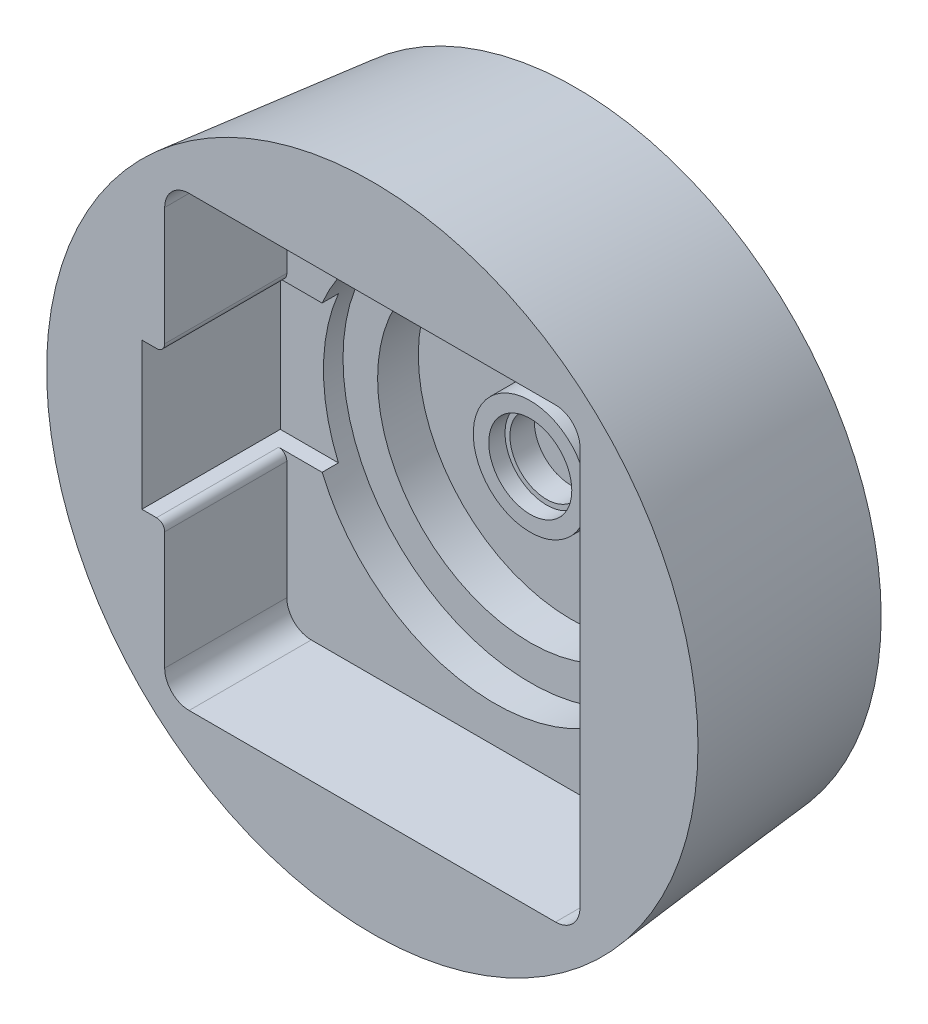
ISO-10303-21;
HEADER;
FILE_DESCRIPTION(('STEP AP214'),'2;1');
FILE_NAME('part.step','',(''),(''),'','','');
FILE_SCHEMA(('AUTOMOTIVE_DESIGN { 1 0 10303 214 1 1 1 1 }'));
ENDSEC;
DATA;
#1=APPLICATION_CONTEXT('core data for automotive mechanical design processes');
#2=APPLICATION_PROTOCOL_DEFINITION('international standard','automotive_design',2000,#1);
#3=PRODUCT_CONTEXT('',#1,'mechanical');
#4=PRODUCT('Part','Part','',(#3));
#5=PRODUCT_RELATED_PRODUCT_CATEGORY('part','',(#4));
#6=PRODUCT_DEFINITION_FORMATION('','',#4);
#7=PRODUCT_DEFINITION_CONTEXT('part definition',#1,'design');
#8=PRODUCT_DEFINITION('design','',#6,#7);
#9=PRODUCT_DEFINITION_SHAPE('','',#8);
#10=(LENGTH_UNIT() NAMED_UNIT(*) SI_UNIT(.MILLI.,.METRE.));
#11=(NAMED_UNIT(*) PLANE_ANGLE_UNIT() SI_UNIT($,.RADIAN.));
#12=(NAMED_UNIT(*) SI_UNIT($,.STERADIAN.) SOLID_ANGLE_UNIT());
#13=UNCERTAINTY_MEASURE_WITH_UNIT(LENGTH_MEASURE(1.E-05),#10,'distance_accuracy_value','');
#14=(GEOMETRIC_REPRESENTATION_CONTEXT(3) GLOBAL_UNCERTAINTY_ASSIGNED_CONTEXT((#13)) GLOBAL_UNIT_ASSIGNED_CONTEXT((#10,
#11,#12)) REPRESENTATION_CONTEXT('',''));
#15=CARTESIAN_POINT('',(0.,0.,0.));
#16=DIRECTION('',(0.,0.,1.));
#17=DIRECTION('',(1.,0.,0.));
#18=AXIS2_PLACEMENT_3D('',#15,#16,#17);
#19=CARTESIAN_POINT('',(-25.5,-27.5,-15.));
#20=DIRECTION('',(-1.,0.,0.));
#21=DIRECTION('',(0.,0.,1.));
#22=AXIS2_PLACEMENT_3D('',#19,#20,#21);
#23=PLANE('',#22);
#24=DIRECTION('',(0.,-1.,0.));
#25=VECTOR('',#24,1.);
#26=CARTESIAN_POINT('',(-25.5,-27.5,0.));
#27=LINE('',#26,#25);
#28=CARTESIAN_POINT('',(-25.5,24.5,0.));
#29=VERTEX_POINT('',#28);
#30=CARTESIAN_POINT('',(-25.5,9.99999999999999,0.));
#31=VERTEX_POINT('',#30);
#32=EDGE_CURVE('E254',#29,#31,#27,.T.);
#33=ORIENTED_EDGE('',*,*,#32,.T.);
#34=DIRECTION('',(0.,0.,-1.));
#35=VECTOR('',#34,1.);
#36=CARTESIAN_POINT('',(-25.5,9.99999999999999,-15.));
#37=LINE('',#36,#35);
#38=CARTESIAN_POINT('',(-25.5,9.99999999999999,-15.));
#39=VERTEX_POINT('',#38);
#40=EDGE_CURVE('E187',#31,#39,#37,.T.);
#41=ORIENTED_EDGE('',*,*,#40,.T.);
#42=DIRECTION('',(0.,-1.,0.));
#43=VECTOR('',#42,1.);
#44=CARTESIAN_POINT('',(-25.5,-27.5,-15.));
#45=LINE('',#44,#43);
#46=CARTESIAN_POINT('',(-25.5,24.5,-15.));
#47=VERTEX_POINT('',#46);
#48=EDGE_CURVE('E203',#47,#39,#45,.T.);
#49=ORIENTED_EDGE('',*,*,#48,.F.);
#50=DIRECTION('',(0.,0.,1.));
#51=VECTOR('',#50,1.);
#52=CARTESIAN_POINT('',(-25.5,24.5,0.));
#53=LINE('',#52,#51);
#54=EDGE_CURVE('E282',#47,#29,#53,.T.);
#55=ORIENTED_EDGE('',*,*,#54,.T.);
#56=EDGE_LOOP('',(#33,#41,#49,#55));
#57=FACE_BOUND('',#56,.T.);
#58=ADVANCED_FACE('F38',(#57),#23,.F.);
#59=CARTESIAN_POINT('',(0.,0.,-25.));
#60=DIRECTION('',(0.,0.,-1.));
#61=DIRECTION('',(-1.,0.,0.));
#62=AXIS2_PLACEMENT_3D('',#59,#60,#61);
#63=PLANE('',#62);
#64=CARTESIAN_POINT('',(0.,0.,-25.));
#65=DIRECTION('',(0.,0.,1.));
#66=DIRECTION('',(1.,0.,0.));
#67=AXIS2_PLACEMENT_3D('',#64,#65,#66);
#68=CIRCLE('',#67,37.5);
#69=CARTESIAN_POINT('',(37.5,0.,-25.));
#70=VERTEX_POINT('',#69);
#71=EDGE_CURVE('E261',#70,#70,#68,.T.);
#72=ORIENTED_EDGE('',*,*,#71,.F.);
#73=EDGE_LOOP('',(#72));
#74=FACE_BOUND('',#73,.T.);
#75=ADVANCED_FACE('F410',(#74),#63,.T.);
#76=CARTESIAN_POINT('',(0.,0.,0.));
#77=DIRECTION('',(0.,0.,1.));
#78=DIRECTION('',(1.,0.,0.));
#79=AXIS2_PLACEMENT_3D('',#76,#77,#78);
#80=CONICAL_SURFACE('',#79,40.,0.0996686524911621);
#81=ORIENTED_EDGE('',*,*,#71,.T.);
#82=EDGE_LOOP('',(#81));
#83=FACE_BOUND('',#82,.T.);
#84=CARTESIAN_POINT('',(0.,0.,0.));
#85=DIRECTION('',(0.,0.,1.));
#86=DIRECTION('',(1.,0.,0.));
#87=AXIS2_PLACEMENT_3D('',#84,#85,#86);
#88=CIRCLE('',#87,40.);
#89=CARTESIAN_POINT('',(40.,0.,0.));
#90=VERTEX_POINT('',#89);
#91=EDGE_CURVE('E248',#90,#90,#88,.T.);
#92=ORIENTED_EDGE('',*,*,#91,.F.);
#93=EDGE_LOOP('',(#92));
#94=FACE_BOUND('',#93,.T.);
#95=ADVANCED_FACE('F415',(#83,#94),#80,.T.);
#96=CARTESIAN_POINT('',(40.,0.,0.));
#97=DIRECTION('',(0.,0.,1.));
#98=DIRECTION('',(1.,0.,0.));
#99=AXIS2_PLACEMENT_3D('',#96,#97,#98);
#100=PLANE('',#99);
#101=CARTESIAN_POINT('',(-25.5,-10.,0.));
#102=VERTEX_POINT('',#101);
#103=CARTESIAN_POINT('',(-25.5,-24.5,0.));
#104=VERTEX_POINT('',#103);
#105=EDGE_CURVE('E215',#102,#104,#27,.T.);
#106=ORIENTED_EDGE('',*,*,#105,.F.);
#107=CARTESIAN_POINT('',(-26.5,-10.,0.));
#108=DIRECTION('',(0.,0.,1.));
#109=DIRECTION('',(1.,0.,0.));
#110=AXIS2_PLACEMENT_3D('',#107,#108,#109);
#111=CIRCLE('',#110,1.);
#112=CARTESIAN_POINT('',(-26.5,-9.00000000000001,0.));
#113=VERTEX_POINT('',#112);
#114=EDGE_CURVE('E182',#102,#113,#111,.T.);
#115=ORIENTED_EDGE('',*,*,#114,.T.);
#116=DIRECTION('',(1.,0.,0.));
#117=VECTOR('',#116,1.);
#118=CARTESIAN_POINT('',(-28.3,-9.00000000000001,0.));
#119=LINE('',#118,#117);
#120=CARTESIAN_POINT('',(-28.3,-9.00000000000001,0.));
#121=VERTEX_POINT('',#120);
#122=EDGE_CURVE('E213',#121,#113,#119,.T.);
#123=ORIENTED_EDGE('',*,*,#122,.F.);
#124=DIRECTION('',(0.,-1.,0.));
#125=VECTOR('',#124,1.);
#126=CARTESIAN_POINT('',(-28.3,-9.00000000000001,0.));
#127=LINE('',#126,#125);
#128=CARTESIAN_POINT('',(-28.3,8.99999999999999,0.));
#129=VERTEX_POINT('',#128);
#130=EDGE_CURVE('E221',#129,#121,#127,.T.);
#131=ORIENTED_EDGE('',*,*,#130,.F.);
#132=DIRECTION('',(-1.,0.,0.));
#133=VECTOR('',#132,1.);
#134=CARTESIAN_POINT('',(-28.3,8.99999999999999,0.));
#135=LINE('',#134,#133);
#136=CARTESIAN_POINT('',(-26.5,8.99999999999999,0.));
#137=VERTEX_POINT('',#136);
#138=EDGE_CURVE('E165',#137,#129,#135,.T.);
#139=ORIENTED_EDGE('',*,*,#138,.F.);
#140=CARTESIAN_POINT('',(-26.5,9.99999999999999,0.));
#141=DIRECTION('',(0.,0.,1.));
#142=DIRECTION('',(1.,0.,0.));
#143=AXIS2_PLACEMENT_3D('',#140,#141,#142);
#144=CIRCLE('',#143,1.);
#145=EDGE_CURVE('E180',#137,#31,#144,.T.);
#146=ORIENTED_EDGE('',*,*,#145,.T.);
#147=ORIENTED_EDGE('',*,*,#32,.F.);
#148=CARTESIAN_POINT('',(-22.5,24.5,0.));
#149=DIRECTION('',(0.,0.,1.));
#150=DIRECTION('',(1.,0.,0.));
#151=AXIS2_PLACEMENT_3D('',#148,#149,#150);
#152=CIRCLE('',#151,3.);
#153=CARTESIAN_POINT('',(-22.5,27.5,0.));
#154=VERTEX_POINT('',#153);
#155=EDGE_CURVE('E295',#29,#154,#152,.F.);
#156=ORIENTED_EDGE('',*,*,#155,.T.);
#157=DIRECTION('',(-1.,0.,0.));
#158=VECTOR('',#157,1.);
#159=CARTESIAN_POINT('',(-25.5,27.5,0.));
#160=LINE('',#159,#158);
#161=CARTESIAN_POINT('',(22.5,27.5,0.));
#162=VERTEX_POINT('',#161);
#163=EDGE_CURVE('E251',#162,#154,#160,.T.);
#164=ORIENTED_EDGE('',*,*,#163,.F.);
#165=CARTESIAN_POINT('',(22.5,24.5,0.));
#166=DIRECTION('',(0.,0.,1.));
#167=DIRECTION('',(1.,0.,0.));
#168=AXIS2_PLACEMENT_3D('',#165,#166,#167);
#169=CIRCLE('',#168,3.);
#170=CARTESIAN_POINT('',(25.5,24.5,0.));
#171=VERTEX_POINT('',#170);
#172=EDGE_CURVE('E174',#162,#171,#169,.F.);
#173=ORIENTED_EDGE('',*,*,#172,.T.);
#174=DIRECTION('',(0.,1.,0.));
#175=VECTOR('',#174,1.);
#176=CARTESIAN_POINT('',(25.5,-27.5,0.));
#177=LINE('',#176,#175);
#178=CARTESIAN_POINT('',(25.5,-24.5,0.));
#179=VERTEX_POINT('',#178);
#180=EDGE_CURVE('E232',#179,#171,#177,.T.);
#181=ORIENTED_EDGE('',*,*,#180,.F.);
#182=CARTESIAN_POINT('',(22.5,-24.5,0.));
#183=DIRECTION('',(0.,0.,1.));
#184=DIRECTION('',(1.,0.,0.));
#185=AXIS2_PLACEMENT_3D('',#182,#183,#184);
#186=CIRCLE('',#185,3.);
#187=CARTESIAN_POINT('',(22.5,-27.5,0.));
#188=VERTEX_POINT('',#187);
#189=EDGE_CURVE('E291',#179,#188,#186,.F.);
#190=ORIENTED_EDGE('',*,*,#189,.T.);
#191=DIRECTION('',(1.,0.,0.));
#192=VECTOR('',#191,1.);
#193=CARTESIAN_POINT('',(-25.5,-27.5,0.));
#194=LINE('',#193,#192);
#195=CARTESIAN_POINT('',(-22.5,-27.5,0.));
#196=VERTEX_POINT('',#195);
#197=EDGE_CURVE('E242',#196,#188,#194,.T.);
#198=ORIENTED_EDGE('',*,*,#197,.F.);
#199=CARTESIAN_POINT('',(-22.5,-24.5,0.));
#200=DIRECTION('',(0.,0.,1.));
#201=DIRECTION('',(1.,0.,0.));
#202=AXIS2_PLACEMENT_3D('',#199,#200,#201);
#203=CIRCLE('',#202,3.);
#204=EDGE_CURVE('E293',#196,#104,#203,.F.);
#205=ORIENTED_EDGE('',*,*,#204,.T.);
#206=EDGE_LOOP('',(#106,#115,#123,#131,#139,#146,#147,#156,#164,#173,#181,#190,#198,#205));
#207=FACE_BOUND('',#206,.T.);
#208=ORIENTED_EDGE('',*,*,#91,.T.);
#209=EDGE_LOOP('',(#208));
#210=FACE_BOUND('',#209,.T.);
#211=ADVANCED_FACE('F210',(#207,#210),#100,.T.);
#212=CARTESIAN_POINT('',(25.5,-27.5,-15.));
#213=DIRECTION('',(1.,0.,0.));
#214=DIRECTION('',(0.,0.,-1.));
#215=AXIS2_PLACEMENT_3D('',#212,#213,#214);
#216=PLANE('',#215);
#217=DIRECTION('',(0.,1.,0.));
#218=VECTOR('',#217,1.);
#219=CARTESIAN_POINT('',(25.5,-27.5,-15.));
#220=LINE('',#219,#218);
#221=CARTESIAN_POINT('',(25.5,-24.5,-15.));
#222=VERTEX_POINT('',#221);
#223=CARTESIAN_POINT('',(25.5,24.5,-15.));
#224=VERTEX_POINT('',#223);
#225=EDGE_CURVE('E239',#222,#224,#220,.T.);
#226=ORIENTED_EDGE('',*,*,#225,.F.);
#227=DIRECTION('',(0.,0.,1.));
#228=VECTOR('',#227,1.);
#229=CARTESIAN_POINT('',(25.5,-24.5,0.));
#230=LINE('',#229,#228);
#231=EDGE_CURVE('E266',#222,#179,#230,.T.);
#232=ORIENTED_EDGE('',*,*,#231,.T.);
#233=ORIENTED_EDGE('',*,*,#180,.T.);
#234=DIRECTION('',(0.,0.,1.));
#235=VECTOR('',#234,1.);
#236=CARTESIAN_POINT('',(25.5,24.5,-15.));
#237=LINE('',#236,#235);
#238=EDGE_CURVE('E264',#171,#224,#237,.F.);
#239=ORIENTED_EDGE('',*,*,#238,.T.);
#240=EDGE_LOOP('',(#226,#232,#233,#239));
#241=FACE_BOUND('',#240,.T.);
#242=ADVANCED_FACE('F303',(#241),#216,.F.);
#243=CARTESIAN_POINT('',(-25.5,-27.5,-15.));
#244=DIRECTION('',(0.,-1.,0.));
#245=DIRECTION('',(0.,0.,-1.));
#246=AXIS2_PLACEMENT_3D('',#243,#244,#245);
#247=PLANE('',#246);
#248=ORIENTED_EDGE('',*,*,#197,.T.);
#249=DIRECTION('',(0.,0.,1.));
#250=VECTOR('',#249,1.);
#251=CARTESIAN_POINT('',(22.5,-27.5,-15.));
#252=LINE('',#251,#250);
#253=CARTESIAN_POINT('',(22.5,-27.5,-15.));
#254=VERTEX_POINT('',#253);
#255=EDGE_CURVE('E272',#188,#254,#252,.F.);
#256=ORIENTED_EDGE('',*,*,#255,.T.);
#257=DIRECTION('',(1.,0.,0.));
#258=VECTOR('',#257,1.);
#259=CARTESIAN_POINT('',(-25.5,-27.5,-15.));
#260=LINE('',#259,#258);
#261=CARTESIAN_POINT('',(-22.5,-27.5,-15.));
#262=VERTEX_POINT('',#261);
#263=EDGE_CURVE('E245',#262,#254,#260,.T.);
#264=ORIENTED_EDGE('',*,*,#263,.F.);
#265=DIRECTION('',(0.,0.,1.));
#266=VECTOR('',#265,1.);
#267=CARTESIAN_POINT('',(-22.5,-27.5,0.));
#268=LINE('',#267,#266);
#269=EDGE_CURVE('E269',#262,#196,#268,.T.);
#270=ORIENTED_EDGE('',*,*,#269,.T.);
#271=EDGE_LOOP('',(#248,#256,#264,#270));
#272=FACE_BOUND('',#271,.T.);
#273=ADVANCED_FACE('F421',(#272),#247,.F.);
#274=CARTESIAN_POINT('',(-25.5,-10.,-15.));
#275=VERTEX_POINT('',#274);
#276=CARTESIAN_POINT('',(-25.5,-24.5,-15.));
#277=VERTEX_POINT('',#276);
#278=EDGE_CURVE('E192',#275,#277,#45,.T.);
#279=ORIENTED_EDGE('',*,*,#278,.F.);
#280=DIRECTION('',(0.,0.,1.));
#281=VECTOR('',#280,1.);
#282=CARTESIAN_POINT('',(-25.5,-10.,-15.));
#283=LINE('',#282,#281);
#284=EDGE_CURVE('E172',#275,#102,#283,.T.);
#285=ORIENTED_EDGE('',*,*,#284,.T.);
#286=ORIENTED_EDGE('',*,*,#105,.T.);
#287=DIRECTION('',(0.,0.,1.));
#288=VECTOR('',#287,1.);
#289=CARTESIAN_POINT('',(-25.5,-24.5,-15.));
#290=LINE('',#289,#288);
#291=EDGE_CURVE('E201',#104,#277,#290,.F.);
#292=ORIENTED_EDGE('',*,*,#291,.T.);
#293=EDGE_LOOP('',(#279,#285,#286,#292));
#294=FACE_BOUND('',#293,.T.);
#295=ADVANCED_FACE('F198',(#294),#23,.F.);
#296=CARTESIAN_POINT('',(-25.5,27.5,-15.));
#297=DIRECTION('',(0.,1.,0.));
#298=DIRECTION('',(0.,0.,1.));
#299=AXIS2_PLACEMENT_3D('',#296,#297,#298);
#300=PLANE('',#299);
#301=ORIENTED_EDGE('',*,*,#163,.T.);
#302=DIRECTION('',(0.,0.,1.));
#303=VECTOR('',#302,1.);
#304=CARTESIAN_POINT('',(-22.5,27.5,-15.));
#305=LINE('',#304,#303);
#306=CARTESIAN_POINT('',(-22.5,27.5,-15.));
#307=VERTEX_POINT('',#306);
#308=EDGE_CURVE('E289',#154,#307,#305,.F.);
#309=ORIENTED_EDGE('',*,*,#308,.T.);
#310=DIRECTION('',(-1.,0.,0.));
#311=VECTOR('',#310,1.);
#312=CARTESIAN_POINT('',(-25.5,27.5,-15.));
#313=LINE('',#312,#311);
#314=CARTESIAN_POINT('',(22.5,27.5,-15.));
#315=VERTEX_POINT('',#314);
#316=EDGE_CURVE('E204',#315,#307,#313,.T.);
#317=ORIENTED_EDGE('',*,*,#316,.F.);
#318=DIRECTION('',(0.,0.,1.));
#319=VECTOR('',#318,1.);
#320=CARTESIAN_POINT('',(22.5,27.5,0.));
#321=LINE('',#320,#319);
#322=EDGE_CURVE('E286',#315,#162,#321,.T.);
#323=ORIENTED_EDGE('',*,*,#322,.T.);
#324=EDGE_LOOP('',(#301,#309,#317,#323));
#325=FACE_BOUND('',#324,.T.);
#326=ADVANCED_FACE('F310',(#325),#300,.F.);
#327=CARTESIAN_POINT('',(0.,0.,-15.));
#328=DIRECTION('',(0.,0.,-1.));
#329=DIRECTION('',(-1.,0.,0.));
#330=AXIS2_PLACEMENT_3D('',#327,#328,#329);
#331=PLANE('',#330);
#332=DIRECTION('',(1.,0.,0.));
#333=VECTOR('',#332,1.);
#334=CARTESIAN_POINT('',(0.,8.99999999999999,-15.));
#335=LINE('',#334,#333);
#336=CARTESIAN_POINT('',(-26.5,8.99999999999999,-15.));
#337=VERTEX_POINT('',#336);
#338=CARTESIAN_POINT('',(-21.1660104885167,8.99999999999999,-15.));
#339=VERTEX_POINT('',#338);
#340=EDGE_CURVE('E53',#337,#339,#335,.T.);
#341=ORIENTED_EDGE('',*,*,#340,.T.);
#342=CARTESIAN_POINT('',(0.,0.,-15.));
#343=DIRECTION('',(0.,0.,1.));
#344=DIRECTION('',(1.,0.,0.));
#345=AXIS2_PLACEMENT_3D('',#342,#343,#344);
#346=CIRCLE('',#345,23.);
#347=CARTESIAN_POINT('',(-21.1660104885167,-9.00000000000001,-15.));
#348=VERTEX_POINT('',#347);
#349=EDGE_CURVE('E150',#348,#339,#346,.T.);
#350=ORIENTED_EDGE('',*,*,#349,.F.);
#351=DIRECTION('',(-1.,0.,0.));
#352=VECTOR('',#351,1.);
#353=CARTESIAN_POINT('',(0.,-9.00000000000001,-15.));
#354=LINE('',#353,#352);
#355=CARTESIAN_POINT('',(-26.5,-9.00000000000001,-15.));
#356=VERTEX_POINT('',#355);
#357=EDGE_CURVE('E170',#348,#356,#354,.T.);
#358=ORIENTED_EDGE('',*,*,#357,.T.);
#359=CARTESIAN_POINT('',(-26.5,-10.,-15.));
#360=DIRECTION('',(0.,0.,-1.));
#361=DIRECTION('',(-1.,0.,0.));
#362=AXIS2_PLACEMENT_3D('',#359,#360,#361);
#363=CIRCLE('',#362,1.);
#364=EDGE_CURVE('E46',#356,#275,#363,.T.);
#365=ORIENTED_EDGE('',*,*,#364,.T.);
#366=ORIENTED_EDGE('',*,*,#278,.T.);
#367=CARTESIAN_POINT('',(-22.5,-24.5,-15.));
#368=DIRECTION('',(0.,0.,-1.));
#369=DIRECTION('',(-1.,0.,0.));
#370=AXIS2_PLACEMENT_3D('',#367,#368,#369);
#371=CIRCLE('',#370,3.);
#372=EDGE_CURVE('E278',#277,#262,#371,.F.);
#373=ORIENTED_EDGE('',*,*,#372,.T.);
#374=ORIENTED_EDGE('',*,*,#263,.T.);
#375=CARTESIAN_POINT('',(22.5,-24.5,-15.));
#376=DIRECTION('',(0.,0.,-1.));
#377=DIRECTION('',(-1.,0.,0.));
#378=AXIS2_PLACEMENT_3D('',#375,#376,#377);
#379=CIRCLE('',#378,3.);
#380=EDGE_CURVE('E280',#254,#222,#379,.F.);
#381=ORIENTED_EDGE('',*,*,#380,.T.);
#382=ORIENTED_EDGE('',*,*,#225,.T.);
#383=CARTESIAN_POINT('',(22.5,24.5,-15.));
#384=DIRECTION('',(0.,0.,-1.));
#385=DIRECTION('',(-1.,0.,0.));
#386=AXIS2_PLACEMENT_3D('',#383,#384,#385);
#387=CIRCLE('',#386,3.);
#388=EDGE_CURVE('E274',#224,#315,#387,.F.);
#389=ORIENTED_EDGE('',*,*,#388,.T.);
#390=ORIENTED_EDGE('',*,*,#316,.T.);
#391=CARTESIAN_POINT('',(-22.5,24.5,-15.));
#392=DIRECTION('',(0.,0.,-1.));
#393=DIRECTION('',(-1.,0.,0.));
#394=AXIS2_PLACEMENT_3D('',#391,#392,#393);
#395=CIRCLE('',#394,3.);
#396=EDGE_CURVE('E276',#307,#47,#395,.F.);
#397=ORIENTED_EDGE('',*,*,#396,.T.);
#398=ORIENTED_EDGE('',*,*,#48,.T.);
#399=CARTESIAN_POINT('',(-26.5,9.99999999999999,-15.));
#400=DIRECTION('',(0.,0.,-1.));
#401=DIRECTION('',(-1.,0.,0.));
#402=AXIS2_PLACEMENT_3D('',#399,#400,#401);
#403=CIRCLE('',#402,1.);
#404=EDGE_CURVE('E13',#39,#337,#403,.T.);
#405=ORIENTED_EDGE('',*,*,#404,.T.);
#406=EDGE_LOOP('',(#341,#350,#358,#365,#366,#373,#374,#381,#382,#389,#390,#397,#398,#405));
#407=FACE_BOUND('',#406,.T.);
#408=ADVANCED_FACE('F167',(#407),#331,.F.);
#409=CARTESIAN_POINT('',(22.5,-24.5,-15.));
#410=DIRECTION('',(0.,0.,-1.));
#411=DIRECTION('',(-1.,0.,0.));
#412=AXIS2_PLACEMENT_3D('',#409,#410,#411);
#413=CYLINDRICAL_SURFACE('',#412,3.);
#414=ORIENTED_EDGE('',*,*,#380,.F.);
#415=ORIENTED_EDGE('',*,*,#255,.F.);
#416=ORIENTED_EDGE('',*,*,#189,.F.);
#417=ORIENTED_EDGE('',*,*,#231,.F.);
#418=EDGE_LOOP('',(#414,#415,#416,#417));
#419=FACE_BOUND('',#418,.T.);
#420=ADVANCED_FACE('F434',(#419),#413,.F.);
#421=CARTESIAN_POINT('',(-22.5,-24.5,-15.));
#422=DIRECTION('',(0.,0.,-1.));
#423=DIRECTION('',(-1.,0.,0.));
#424=AXIS2_PLACEMENT_3D('',#421,#422,#423);
#425=CYLINDRICAL_SURFACE('',#424,3.);
#426=ORIENTED_EDGE('',*,*,#372,.F.);
#427=ORIENTED_EDGE('',*,*,#291,.F.);
#428=ORIENTED_EDGE('',*,*,#204,.F.);
#429=ORIENTED_EDGE('',*,*,#269,.F.);
#430=EDGE_LOOP('',(#426,#427,#428,#429));
#431=FACE_BOUND('',#430,.T.);
#432=ADVANCED_FACE('F471',(#431),#425,.F.);
#433=CARTESIAN_POINT('',(-22.5,24.5,-15.));
#434=DIRECTION('',(0.,0.,-1.));
#435=DIRECTION('',(-1.,0.,0.));
#436=AXIS2_PLACEMENT_3D('',#433,#434,#435);
#437=CYLINDRICAL_SURFACE('',#436,3.);
#438=ORIENTED_EDGE('',*,*,#396,.F.);
#439=ORIENTED_EDGE('',*,*,#308,.F.);
#440=ORIENTED_EDGE('',*,*,#155,.F.);
#441=ORIENTED_EDGE('',*,*,#54,.F.);
#442=EDGE_LOOP('',(#438,#439,#440,#441));
#443=FACE_BOUND('',#442,.T.);
#444=ADVANCED_FACE('F313',(#443),#437,.F.);
#445=CARTESIAN_POINT('',(22.5,24.5,-15.));
#446=DIRECTION('',(0.,0.,-1.));
#447=DIRECTION('',(-1.,0.,0.));
#448=AXIS2_PLACEMENT_3D('',#445,#446,#447);
#449=CYLINDRICAL_SURFACE('',#448,3.);
#450=ORIENTED_EDGE('',*,*,#388,.F.);
#451=ORIENTED_EDGE('',*,*,#238,.F.);
#452=ORIENTED_EDGE('',*,*,#172,.F.);
#453=ORIENTED_EDGE('',*,*,#322,.F.);
#454=EDGE_LOOP('',(#450,#451,#452,#453));
#455=FACE_BOUND('',#454,.T.);
#456=ADVANCED_FACE('F306',(#455),#449,.F.);
#457=CARTESIAN_POINT('',(-28.3,8.99999999999999,-39.591260281974));
#458=DIRECTION('',(0.,1.,0.));
#459=DIRECTION('',(0.,0.,1.));
#460=AXIS2_PLACEMENT_3D('',#457,#458,#459);
#461=PLANE('',#460);
#462=ORIENTED_EDGE('',*,*,#340,.F.);
#463=DIRECTION('',(0.,0.,-1.));
#464=VECTOR('',#463,1.);
#465=CARTESIAN_POINT('',(-26.5,8.99999999999999,-39.591260281974));
#466=LINE('',#465,#464);
#467=EDGE_CURVE('E189',#337,#137,#466,.F.);
#468=ORIENTED_EDGE('',*,*,#467,.T.);
#469=ORIENTED_EDGE('',*,*,#138,.T.);
#470=DIRECTION('',(0.,0.,1.));
#471=VECTOR('',#470,1.);
#472=CARTESIAN_POINT('',(-28.3,8.99999999999999,-39.591260281974));
#473=LINE('',#472,#471);
#474=CARTESIAN_POINT('',(-28.3,8.99999999999999,-17.));
#475=VERTEX_POINT('',#474);
#476=EDGE_CURVE('E223',#475,#129,#473,.T.);
#477=ORIENTED_EDGE('',*,*,#476,.F.);
#478=DIRECTION('',(-1.,0.,0.));
#479=VECTOR('',#478,1.);
#480=CARTESIAN_POINT('',(-28.3,8.99999999999999,-17.));
#481=LINE('',#480,#479);
#482=CARTESIAN_POINT('',(-21.1660104885167,8.99999999999999,-17.));
#483=VERTEX_POINT('',#482);
#484=EDGE_CURVE('E164',#483,#475,#481,.T.);
#485=ORIENTED_EDGE('',*,*,#484,.F.);
#486=DIRECTION('',(0.,0.,1.));
#487=VECTOR('',#486,1.);
#488=CARTESIAN_POINT('',(-21.1660104885167,8.99999999999999,-19.4));
#489=LINE('',#488,#487);
#490=EDGE_CURVE('E152',#483,#339,#489,.T.);
#491=ORIENTED_EDGE('',*,*,#490,.T.);
#492=EDGE_LOOP('',(#462,#468,#469,#477,#485,#491));
#493=FACE_BOUND('',#492,.T.);
#494=ADVANCED_FACE('F162',(#493),#461,.F.);
#495=CARTESIAN_POINT('',(-28.3,-9.00000000000001,-39.591260281974));
#496=DIRECTION('',(0.,-1.,0.));
#497=DIRECTION('',(0.,0.,-1.));
#498=AXIS2_PLACEMENT_3D('',#495,#496,#497);
#499=PLANE('',#498);
#500=ORIENTED_EDGE('',*,*,#122,.T.);
#501=DIRECTION('',(0.,0.,1.));
#502=VECTOR('',#501,1.);
#503=CARTESIAN_POINT('',(-26.5,-9.00000000000001,-39.591260281974));
#504=LINE('',#503,#502);
#505=EDGE_CURVE('E184',#113,#356,#504,.F.);
#506=ORIENTED_EDGE('',*,*,#505,.T.);
#507=ORIENTED_EDGE('',*,*,#357,.F.);
#508=DIRECTION('',(0.,0.,1.));
#509=VECTOR('',#508,1.);
#510=CARTESIAN_POINT('',(-21.1660104885167,-9.00000000000001,-19.4));
#511=LINE('',#510,#509);
#512=CARTESIAN_POINT('',(-21.1660104885167,-9.00000000000001,-17.));
#513=VERTEX_POINT('',#512);
#514=EDGE_CURVE('E155',#348,#513,#511,.F.);
#515=ORIENTED_EDGE('',*,*,#514,.T.);
#516=DIRECTION('',(1.,0.,0.));
#517=VECTOR('',#516,1.);
#518=CARTESIAN_POINT('',(-28.3,-9.00000000000001,-17.));
#519=LINE('',#518,#517);
#520=CARTESIAN_POINT('',(-28.3,-9.00000000000001,-17.));
#521=VERTEX_POINT('',#520);
#522=EDGE_CURVE('E229',#521,#513,#519,.T.);
#523=ORIENTED_EDGE('',*,*,#522,.F.);
#524=DIRECTION('',(0.,0.,1.));
#525=VECTOR('',#524,1.);
#526=CARTESIAN_POINT('',(-28.3,-9.00000000000001,-39.591260281974));
#527=LINE('',#526,#525);
#528=EDGE_CURVE('E219',#521,#121,#527,.T.);
#529=ORIENTED_EDGE('',*,*,#528,.T.);
#530=EDGE_LOOP('',(#500,#506,#507,#515,#523,#529));
#531=FACE_BOUND('',#530,.T.);
#532=ADVANCED_FACE('F217',(#531),#499,.F.);
#533=CARTESIAN_POINT('',(0.,0.,-17.));
#534=DIRECTION('',(0.,0.,-1.));
#535=DIRECTION('',(-1.,0.,0.));
#536=AXIS2_PLACEMENT_3D('',#533,#534,#535);
#537=PLANE('',#536);
#538=ORIENTED_EDGE('',*,*,#522,.T.);
#539=CARTESIAN_POINT('',(0.,0.,-17.));
#540=DIRECTION('',(0.,0.,-1.));
#541=DIRECTION('',(-1.,0.,0.));
#542=AXIS2_PLACEMENT_3D('',#539,#540,#541);
#543=CIRCLE('',#542,23.);
#544=EDGE_CURVE('E169',#513,#483,#543,.T.);
#545=ORIENTED_EDGE('',*,*,#544,.T.);
#546=ORIENTED_EDGE('',*,*,#484,.T.);
#547=DIRECTION('',(0.,-1.,0.));
#548=VECTOR('',#547,1.);
#549=CARTESIAN_POINT('',(-28.3,-9.00000000000001,-17.));
#550=LINE('',#549,#548);
#551=EDGE_CURVE('E233',#475,#521,#550,.T.);
#552=ORIENTED_EDGE('',*,*,#551,.T.);
#553=EDGE_LOOP('',(#538,#545,#546,#552));
#554=FACE_BOUND('',#553,.T.);
#555=ADVANCED_FACE('F324',(#554),#537,.F.);
#556=CARTESIAN_POINT('',(-28.3,-9.00000000000001,-39.591260281974));
#557=DIRECTION('',(-1.,0.,0.));
#558=DIRECTION('',(0.,0.,1.));
#559=AXIS2_PLACEMENT_3D('',#556,#557,#558);
#560=PLANE('',#559);
#561=ORIENTED_EDGE('',*,*,#476,.T.);
#562=ORIENTED_EDGE('',*,*,#130,.T.);
#563=ORIENTED_EDGE('',*,*,#528,.F.);
#564=ORIENTED_EDGE('',*,*,#551,.F.);
#565=EDGE_LOOP('',(#561,#562,#563,#564));
#566=FACE_BOUND('',#565,.T.);
#567=ADVANCED_FACE('F322',(#566),#560,.F.);
#568=CARTESIAN_POINT('',(0.,0.,-19.4));
#569=DIRECTION('',(0.,0.,1.));
#570=DIRECTION('',(1.,0.,0.));
#571=AXIS2_PLACEMENT_3D('',#568,#569,#570);
#572=CYLINDRICAL_SURFACE('',#571,23.);
#573=CARTESIAN_POINT('',(0.,0.,-19.4));
#574=DIRECTION('',(0.,0.,1.));
#575=DIRECTION('',(1.,0.,0.));
#576=AXIS2_PLACEMENT_3D('',#573,#574,#575);
#577=CIRCLE('',#576,23.);
#578=CARTESIAN_POINT('',(23.,0.,-19.4));
#579=VERTEX_POINT('',#578);
#580=EDGE_CURVE('E158',#579,#579,#577,.T.);
#581=ORIENTED_EDGE('',*,*,#580,.F.);
#582=EDGE_LOOP('',(#581));
#583=FACE_BOUND('',#582,.T.);
#584=ORIENTED_EDGE('',*,*,#544,.F.);
#585=ORIENTED_EDGE('',*,*,#514,.F.);
#586=ORIENTED_EDGE('',*,*,#349,.T.);
#587=ORIENTED_EDGE('',*,*,#490,.F.);
#588=EDGE_LOOP('',(#584,#585,#586,#587));
#589=FACE_BOUND('',#588,.T.);
#590=ADVANCED_FACE('F151',(#583,#589),#572,.F.);
#591=CARTESIAN_POINT('',(0.,0.,-19.4));
#592=DIRECTION('',(0.,0.,1.));
#593=DIRECTION('',(1.,0.,0.));
#594=AXIS2_PLACEMENT_3D('',#591,#592,#593);
#595=PLANE('',#594);
#596=CARTESIAN_POINT('',(0.,0.,-19.4));
#597=DIRECTION('',(0.,0.,1.));
#598=DIRECTION('',(1.,0.,0.));
#599=AXIS2_PLACEMENT_3D('',#596,#597,#598);
#600=CIRCLE('',#599,18.75);
#601=CARTESIAN_POINT('',(18.75,0.,-19.4));
#602=VERTEX_POINT('',#601);
#603=EDGE_CURVE('E328',#602,#602,#600,.T.);
#604=ORIENTED_EDGE('',*,*,#603,.F.);
#605=EDGE_LOOP('',(#604));
#606=FACE_BOUND('',#605,.T.);
#607=ORIENTED_EDGE('',*,*,#580,.T.);
#608=EDGE_LOOP('',(#607));
#609=FACE_BOUND('',#608,.T.);
#610=ADVANCED_FACE('F393',(#606,#609),#595,.T.);
#611=CARTESIAN_POINT('',(0.,0.,-24.4));
#612=DIRECTION('',(0.,0.,1.));
#613=DIRECTION('',(1.,0.,0.));
#614=AXIS2_PLACEMENT_3D('',#611,#612,#613);
#615=CYLINDRICAL_SURFACE('',#614,18.75);
#616=CARTESIAN_POINT('',(0.,0.,-24.4));
#617=DIRECTION('',(0.,0.,1.));
#618=DIRECTION('',(1.,0.,0.));
#619=AXIS2_PLACEMENT_3D('',#616,#617,#618);
#620=CIRCLE('',#619,18.75);
#621=CARTESIAN_POINT('',(18.75,0.,-24.4));
#622=VERTEX_POINT('',#621);
#623=EDGE_CURVE('E159',#622,#622,#620,.T.);
#624=ORIENTED_EDGE('',*,*,#623,.F.);
#625=EDGE_LOOP('',(#624));
#626=FACE_BOUND('',#625,.T.);
#627=ORIENTED_EDGE('',*,*,#603,.T.);
#628=EDGE_LOOP('',(#627));
#629=FACE_BOUND('',#628,.T.);
#630=ADVANCED_FACE('F387',(#626,#629),#615,.F.);
#631=CARTESIAN_POINT('',(0.,0.,-24.4));
#632=DIRECTION('',(0.,0.,1.));
#633=DIRECTION('',(1.,0.,0.));
#634=AXIS2_PLACEMENT_3D('',#631,#632,#633);
#635=PLANE('',#634);
#636=CARTESIAN_POINT('',(0.,0.,-24.4));
#637=DIRECTION('',(0.,0.,1.));
#638=DIRECTION('',(1.,0.,0.));
#639=AXIS2_PLACEMENT_3D('',#636,#637,#638);
#640=CIRCLE('',#639,7.);
#641=CARTESIAN_POINT('',(7.,0.,-24.4));
#642=VERTEX_POINT('',#641);
#643=EDGE_CURVE('E334',#642,#642,#640,.T.);
#644=ORIENTED_EDGE('',*,*,#643,.F.);
#645=EDGE_LOOP('',(#644));
#646=FACE_BOUND('',#645,.T.);
#647=ORIENTED_EDGE('',*,*,#623,.T.);
#648=EDGE_LOOP('',(#647));
#649=FACE_BOUND('',#648,.T.);
#650=ADVANCED_FACE('F381',(#646,#649),#635,.T.);
#651=CARTESIAN_POINT('',(0.,0.,-19.4));
#652=DIRECTION('',(0.,0.,-1.));
#653=DIRECTION('',(-1.,0.,0.));
#654=AXIS2_PLACEMENT_3D('',#651,#652,#653);
#655=CYLINDRICAL_SURFACE('',#654,7.);
#656=CARTESIAN_POINT('',(0.,0.,-19.4));
#657=DIRECTION('',(0.,0.,1.));
#658=DIRECTION('',(1.,0.,0.));
#659=AXIS2_PLACEMENT_3D('',#656,#657,#658);
#660=CIRCLE('',#659,7.);
#661=CARTESIAN_POINT('',(7.,0.,-19.4));
#662=VERTEX_POINT('',#661);
#663=EDGE_CURVE('E331',#662,#662,#660,.T.);
#664=ORIENTED_EDGE('',*,*,#663,.F.);
#665=EDGE_LOOP('',(#664));
#666=FACE_BOUND('',#665,.T.);
#667=ORIENTED_EDGE('',*,*,#643,.T.);
#668=EDGE_LOOP('',(#667));
#669=FACE_BOUND('',#668,.T.);
#670=ADVANCED_FACE('F375',(#666,#669),#655,.T.);
#671=CARTESIAN_POINT('',(0.,0.,-19.4));
#672=DIRECTION('',(0.,0.,1.));
#673=DIRECTION('',(1.,0.,0.));
#674=AXIS2_PLACEMENT_3D('',#671,#672,#673);
#675=PLANE('',#674);
#676=CARTESIAN_POINT('',(0.,0.,-19.4));
#677=DIRECTION('',(0.,0.,1.));
#678=DIRECTION('',(1.,0.,0.));
#679=AXIS2_PLACEMENT_3D('',#676,#677,#678);
#680=CIRCLE('',#679,5.1);
#681=CARTESIAN_POINT('',(5.1,0.,-19.4));
#682=VERTEX_POINT('',#681);
#683=EDGE_CURVE('E340',#682,#682,#680,.T.);
#684=ORIENTED_EDGE('',*,*,#683,.F.);
#685=EDGE_LOOP('',(#684));
#686=FACE_BOUND('',#685,.T.);
#687=ORIENTED_EDGE('',*,*,#663,.T.);
#688=EDGE_LOOP('',(#687));
#689=FACE_BOUND('',#688,.T.);
#690=ADVANCED_FACE('F369',(#686,#689),#675,.T.);
#691=CARTESIAN_POINT('',(0.,0.,-21.4));
#692=DIRECTION('',(0.,0.,1.));
#693=DIRECTION('',(1.,0.,0.));
#694=AXIS2_PLACEMENT_3D('',#691,#692,#693);
#695=CYLINDRICAL_SURFACE('',#694,5.1);
#696=CARTESIAN_POINT('',(0.,0.,-21.4));
#697=DIRECTION('',(0.,0.,1.));
#698=DIRECTION('',(1.,0.,0.));
#699=AXIS2_PLACEMENT_3D('',#696,#697,#698);
#700=CIRCLE('',#699,5.1);
#701=CARTESIAN_POINT('',(5.1,0.,-21.4));
#702=VERTEX_POINT('',#701);
#703=EDGE_CURVE('E337',#702,#702,#700,.T.);
#704=ORIENTED_EDGE('',*,*,#703,.F.);
#705=EDGE_LOOP('',(#704));
#706=FACE_BOUND('',#705,.T.);
#707=ORIENTED_EDGE('',*,*,#683,.T.);
#708=EDGE_LOOP('',(#707));
#709=FACE_BOUND('',#708,.T.);
#710=ADVANCED_FACE('F363',(#706,#709),#695,.F.);
#711=CARTESIAN_POINT('',(0.,0.,-21.4));
#712=DIRECTION('',(0.,0.,1.));
#713=DIRECTION('',(1.,0.,0.));
#714=AXIS2_PLACEMENT_3D('',#711,#712,#713);
#715=PLANE('',#714);
#716=CARTESIAN_POINT('',(0.,0.,-21.4));
#717=DIRECTION('',(0.,0.,1.));
#718=DIRECTION('',(1.,0.,0.));
#719=AXIS2_PLACEMENT_3D('',#716,#717,#718);
#720=CIRCLE('',#719,4.5);
#721=CARTESIAN_POINT('',(4.5,0.,-21.4));
#722=VERTEX_POINT('',#721);
#723=EDGE_CURVE('E346',#722,#722,#720,.T.);
#724=ORIENTED_EDGE('',*,*,#723,.F.);
#725=EDGE_LOOP('',(#724));
#726=FACE_BOUND('',#725,.T.);
#727=ORIENTED_EDGE('',*,*,#703,.T.);
#728=EDGE_LOOP('',(#727));
#729=FACE_BOUND('',#728,.T.);
#730=ADVANCED_FACE('F357',(#726,#729),#715,.T.);
#731=CARTESIAN_POINT('',(0.,0.,-24.4));
#732=DIRECTION('',(0.,0.,1.));
#733=DIRECTION('',(1.,0.,0.));
#734=AXIS2_PLACEMENT_3D('',#731,#732,#733);
#735=CYLINDRICAL_SURFACE('',#734,4.5);
#736=CARTESIAN_POINT('',(0.,0.,-24.4));
#737=DIRECTION('',(0.,0.,1.));
#738=DIRECTION('',(1.,0.,0.));
#739=AXIS2_PLACEMENT_3D('',#736,#737,#738);
#740=CIRCLE('',#739,4.5);
#741=CARTESIAN_POINT('',(4.5,0.,-24.4));
#742=VERTEX_POINT('',#741);
#743=EDGE_CURVE('E343',#742,#742,#740,.T.);
#744=ORIENTED_EDGE('',*,*,#743,.F.);
#745=EDGE_LOOP('',(#744));
#746=FACE_BOUND('',#745,.T.);
#747=ORIENTED_EDGE('',*,*,#723,.T.);
#748=EDGE_LOOP('',(#747));
#749=FACE_BOUND('',#748,.T.);
#750=ADVANCED_FACE('F354',(#746,#749),#735,.F.);
#751=CARTESIAN_POINT('',(0.,0.,-24.4));
#752=DIRECTION('',(0.,0.,1.));
#753=DIRECTION('',(1.,0.,0.));
#754=AXIS2_PLACEMENT_3D('',#751,#752,#753);
#755=PLANE('',#754);
#756=ORIENTED_EDGE('',*,*,#743,.T.);
#757=EDGE_LOOP('',(#756));
#758=FACE_BOUND('',#757,.T.);
#759=ADVANCED_FACE('F352',(#758),#755,.T.);
#760=CARTESIAN_POINT('',(-26.5,-10.,-15.));
#761=DIRECTION('',(0.,0.,1.));
#762=DIRECTION('',(1.,0.,0.));
#763=AXIS2_PLACEMENT_3D('',#760,#761,#762);
#764=CYLINDRICAL_SURFACE('',#763,1.);
#765=ORIENTED_EDGE('',*,*,#364,.F.);
#766=ORIENTED_EDGE('',*,*,#505,.F.);
#767=ORIENTED_EDGE('',*,*,#114,.F.);
#768=ORIENTED_EDGE('',*,*,#284,.F.);
#769=EDGE_LOOP('',(#765,#766,#767,#768));
#770=FACE_BOUND('',#769,.T.);
#771=ADVANCED_FACE('F206',(#770),#764,.T.);
#772=CARTESIAN_POINT('',(-26.5,9.99999999999999,-15.));
#773=DIRECTION('',(0.,0.,-1.));
#774=DIRECTION('',(-1.,0.,0.));
#775=AXIS2_PLACEMENT_3D('',#772,#773,#774);
#776=CYLINDRICAL_SURFACE('',#775,1.);
#777=ORIENTED_EDGE('',*,*,#145,.F.);
#778=ORIENTED_EDGE('',*,*,#467,.F.);
#779=ORIENTED_EDGE('',*,*,#404,.F.);
#780=ORIENTED_EDGE('',*,*,#40,.F.);
#781=EDGE_LOOP('',(#777,#778,#779,#780));
#782=FACE_BOUND('',#781,.T.);
#783=ADVANCED_FACE('F40',(#782),#776,.T.);
#784=CLOSED_SHELL('',(#58,#75,#95,#211,#242,#273,#295,#326,#408,#420,#432,#444,#456,#494,#532,
#555,#567,#590,#610,#630,#650,#670,#690,#710,#730,#750,#759,#771,#783));
#785=MANIFOLD_SOLID_BREP('B2',#784);
#786=ADVANCED_BREP_SHAPE_REPRESENTATION('',(#18,#785),#14);
#787=SHAPE_DEFINITION_REPRESENTATION(#9,#786);
ENDSEC;
END-ISO-10303-21;
